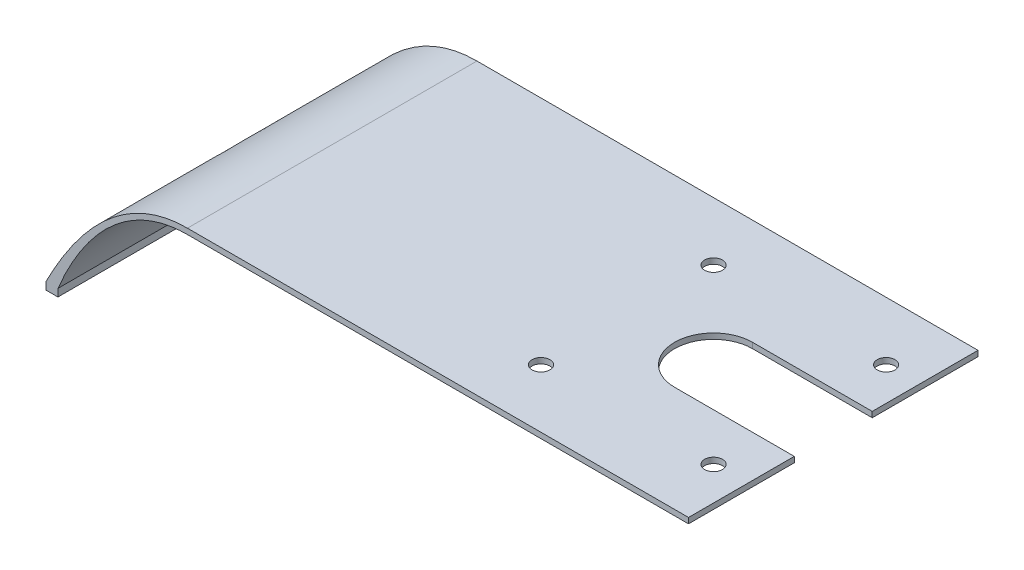
ISO-10303-21;
HEADER;
FILE_DESCRIPTION(('STEP AP214'),'2;1');
FILE_NAME('part.step','',(''),(''),'','','');
FILE_SCHEMA(('AUTOMOTIVE_DESIGN { 1 0 10303 214 1 1 1 1 }'));
ENDSEC;
DATA;
#1=APPLICATION_CONTEXT('core data for automotive mechanical design processes');
#2=APPLICATION_PROTOCOL_DEFINITION('international standard','automotive_design',2000,#1);
#3=PRODUCT_CONTEXT('',#1,'mechanical');
#4=PRODUCT('Part','Part','',(#3));
#5=PRODUCT_RELATED_PRODUCT_CATEGORY('part','',(#4));
#6=PRODUCT_DEFINITION_FORMATION('','',#4);
#7=PRODUCT_DEFINITION_CONTEXT('part definition',#1,'design');
#8=PRODUCT_DEFINITION('design','',#6,#7);
#9=PRODUCT_DEFINITION_SHAPE('','',#8);
#10=(LENGTH_UNIT() NAMED_UNIT(*) SI_UNIT(.MILLI.,.METRE.));
#11=(NAMED_UNIT(*) PLANE_ANGLE_UNIT() SI_UNIT($,.RADIAN.));
#12=(NAMED_UNIT(*) SI_UNIT($,.STERADIAN.) SOLID_ANGLE_UNIT());
#13=UNCERTAINTY_MEASURE_WITH_UNIT(LENGTH_MEASURE(1.E-05),#10,'distance_accuracy_value','');
#14=(GEOMETRIC_REPRESENTATION_CONTEXT(3) GLOBAL_UNCERTAINTY_ASSIGNED_CONTEXT((#13)) GLOBAL_UNIT_ASSIGNED_CONTEXT((#10,
#11,#12)) REPRESENTATION_CONTEXT('',''));
#15=CARTESIAN_POINT('',(0.,0.,0.));
#16=DIRECTION('',(0.,0.,1.));
#17=DIRECTION('',(1.,0.,0.));
#18=AXIS2_PLACEMENT_3D('',#15,#16,#17);
#19=CARTESIAN_POINT('',(90.,20.,52.));
#20=DIRECTION('',(-1.,0.,0.));
#21=DIRECTION('',(0.,0.,1.));
#22=AXIS2_PLACEMENT_3D('',#19,#20,#21);
#23=PLANE('',#22);
#24=DIRECTION('',(0.,0.,-1.));
#25=VECTOR('',#24,1.);
#26=CARTESIAN_POINT('',(90.,20.,52.));
#27=LINE('',#26,#25);
#28=CARTESIAN_POINT('',(90.,20.,52.));
#29=VERTEX_POINT('',#28);
#30=CARTESIAN_POINT('',(90.,20.,33.));
#31=VERTEX_POINT('',#30);
#32=EDGE_CURVE('E129',#29,#31,#27,.T.);
#33=ORIENTED_EDGE('',*,*,#32,.T.);
#34=DIRECTION('',(0.,1.,0.));
#35=VECTOR('',#34,1.);
#36=CARTESIAN_POINT('',(90.,-31.,33.));
#37=LINE('',#36,#35);
#38=CARTESIAN_POINT('',(90.,21.,33.));
#39=VERTEX_POINT('',#38);
#40=EDGE_CURVE('E260',#31,#39,#37,.T.);
#41=ORIENTED_EDGE('',*,*,#40,.T.);
#42=DIRECTION('',(0.,0.,-1.));
#43=VECTOR('',#42,1.);
#44=CARTESIAN_POINT('',(90.,21.,52.));
#45=LINE('',#44,#43);
#46=CARTESIAN_POINT('',(90.,21.,52.));
#47=VERTEX_POINT('',#46);
#48=EDGE_CURVE('E140',#47,#39,#45,.T.);
#49=ORIENTED_EDGE('',*,*,#48,.F.);
#50=DIRECTION('',(0.,1.,0.));
#51=VECTOR('',#50,1.);
#52=CARTESIAN_POINT('',(90.,20.,52.));
#53=LINE('',#52,#51);
#54=EDGE_CURVE('E119',#29,#47,#53,.T.);
#55=ORIENTED_EDGE('',*,*,#54,.F.);
#56=EDGE_LOOP('',(#33,#41,#49,#55));
#57=FACE_BOUND('',#56,.T.);
#58=ADVANCED_FACE('F35',(#57),#23,.F.);
#59=CARTESIAN_POINT('',(0.,21.,52.));
#60=CARTESIAN_POINT('',(-12.5145757386118,21.,52.));
#61=CARTESIAN_POINT('',(-20.5852929416918,9.39347703646513,52.));
#62=CARTESIAN_POINT('',(-25.4098684266543,0.,52.));
#63=B_SPLINE_CURVE_WITH_KNOTS('',3,(#59,#60,#61,#62),.UNSPECIFIED.,.F.,.F.,(4,4),(0.,1.),.UNSPECIFIED.);
#64=DIRECTION('',(0.,0.,-1.));
#65=VECTOR('',#64,1.);
#66=SURFACE_OF_LINEAR_EXTRUSION('',#63,#65);
#67=CARTESIAN_POINT('',(0.,21.,0.));
#68=CARTESIAN_POINT('',(-12.5145757386118,21.,0.));
#69=CARTESIAN_POINT('',(-20.5852929416918,9.39347703646513,0.));
#70=CARTESIAN_POINT('',(-25.4098684266543,0.,0.));
#71=B_SPLINE_CURVE_WITH_KNOTS('',3,(#67,#68,#69,#70),.UNSPECIFIED.,.F.,.F.,(4,4),(0.,1.),.UNSPECIFIED.);
#72=CARTESIAN_POINT('',(0.,21.,0.));
#73=VERTEX_POINT('',#72);
#74=CARTESIAN_POINT('',(-25.4098684266543,0.,0.));
#75=VERTEX_POINT('',#74);
#76=EDGE_CURVE('E146',#73,#75,#71,.T.);
#77=ORIENTED_EDGE('',*,*,#76,.T.);
#78=DIRECTION('',(0.,0.,-1.));
#79=VECTOR('',#78,1.);
#80=CARTESIAN_POINT('',(-25.4098684266543,0.,52.));
#81=LINE('',#80,#79);
#82=CARTESIAN_POINT('',(-25.4098684266543,0.,52.));
#83=VERTEX_POINT('',#82);
#84=EDGE_CURVE('E11',#83,#75,#81,.T.);
#85=ORIENTED_EDGE('',*,*,#84,.F.);
#86=CARTESIAN_POINT('',(0.,21.,52.));
#87=VERTEX_POINT('',#86);
#88=EDGE_CURVE('E174',#87,#83,#63,.T.);
#89=ORIENTED_EDGE('',*,*,#88,.F.);
#90=DIRECTION('',(0.,0.,-1.));
#91=VECTOR('',#90,1.);
#92=CARTESIAN_POINT('',(0.,21.,52.));
#93=LINE('',#92,#91);
#94=EDGE_CURVE('E142',#87,#73,#93,.T.);
#95=ORIENTED_EDGE('',*,*,#94,.T.);
#96=EDGE_LOOP('',(#77,#85,#89,#95));
#97=FACE_BOUND('',#96,.T.);
#98=ADVANCED_FACE('F37',(#97),#66,.F.);
#99=CARTESIAN_POINT('',(-25.4098684266543,0.,52.));
#100=DIRECTION('',(1.,0.,0.));
#101=DIRECTION('',(0.,0.,-1.));
#102=AXIS2_PLACEMENT_3D('',#99,#100,#101);
#103=PLANE('',#102);
#104=DIRECTION('',(0.,-1.,0.));
#105=VECTOR('',#104,1.);
#106=CARTESIAN_POINT('',(-25.4098684266543,0.,0.));
#107=LINE('',#106,#105);
#108=CARTESIAN_POINT('',(-25.4098684266543,-1.34408808895374,0.));
#109=VERTEX_POINT('',#108);
#110=EDGE_CURVE('E151',#75,#109,#107,.T.);
#111=ORIENTED_EDGE('',*,*,#110,.T.);
#112=DIRECTION('',(0.,0.,-1.));
#113=VECTOR('',#112,1.);
#114=CARTESIAN_POINT('',(-25.4098684266543,-1.34408808895374,52.));
#115=LINE('',#114,#113);
#116=CARTESIAN_POINT('',(-25.4098684266543,-1.34408808895374,52.));
#117=VERTEX_POINT('',#116);
#118=EDGE_CURVE('E44',#117,#109,#115,.T.);
#119=ORIENTED_EDGE('',*,*,#118,.F.);
#120=DIRECTION('',(0.,-1.,0.));
#121=VECTOR('',#120,1.);
#122=CARTESIAN_POINT('',(-25.4098684266543,0.,52.));
#123=LINE('',#122,#121);
#124=EDGE_CURVE('E100',#83,#117,#123,.T.);
#125=ORIENTED_EDGE('',*,*,#124,.F.);
#126=ORIENTED_EDGE('',*,*,#84,.T.);
#127=EDGE_LOOP('',(#111,#119,#125,#126));
#128=FACE_BOUND('',#127,.T.);
#129=ADVANCED_FACE('F220',(#128),#103,.F.);
#130=CARTESIAN_POINT('',(-25.4098684266543,-1.34408808895374,52.));
#131=DIRECTION('',(0.,1.,0.));
#132=DIRECTION('',(0.,0.,1.));
#133=AXIS2_PLACEMENT_3D('',#130,#131,#132);
#134=PLANE('',#133);
#135=DIRECTION('',(1.,0.,0.));
#136=VECTOR('',#135,1.);
#137=CARTESIAN_POINT('',(-25.4098684266543,-1.34408808895374,0.));
#138=LINE('',#137,#136);
#139=CARTESIAN_POINT('',(-23.2651190135322,-1.34408808895374,0.));
#140=VERTEX_POINT('',#139);
#141=EDGE_CURVE('E156',#109,#140,#138,.T.);
#142=ORIENTED_EDGE('',*,*,#141,.T.);
#143=DIRECTION('',(0.,0.,-1.));
#144=VECTOR('',#143,1.);
#145=CARTESIAN_POINT('',(-23.2651190135322,-1.34408808895374,52.));
#146=LINE('',#145,#144);
#147=CARTESIAN_POINT('',(-23.2651190135322,-1.34408808895374,52.));
#148=VERTEX_POINT('',#147);
#149=EDGE_CURVE('E182',#148,#140,#146,.T.);
#150=ORIENTED_EDGE('',*,*,#149,.F.);
#151=DIRECTION('',(1.,0.,0.));
#152=VECTOR('',#151,1.);
#153=CARTESIAN_POINT('',(-25.4098684266543,-1.34408808895374,52.));
#154=LINE('',#153,#152);
#155=EDGE_CURVE('E190',#117,#148,#154,.T.);
#156=ORIENTED_EDGE('',*,*,#155,.F.);
#157=ORIENTED_EDGE('',*,*,#118,.T.);
#158=EDGE_LOOP('',(#142,#150,#156,#157));
#159=FACE_BOUND('',#158,.T.);
#160=ADVANCED_FACE('F188',(#159),#134,.F.);
#161=CARTESIAN_POINT('',(-23.2651190135322,-1.34408808895374,52.));
#162=DIRECTION('',(-1.,0.,0.));
#163=DIRECTION('',(0.,0.,1.));
#164=AXIS2_PLACEMENT_3D('',#161,#162,#163);
#165=PLANE('',#164);
#166=DIRECTION('',(0.,1.,0.));
#167=VECTOR('',#166,1.);
#168=CARTESIAN_POINT('',(-23.2651190135322,-1.34408808895374,0.));
#169=LINE('',#168,#167);
#170=CARTESIAN_POINT('',(-23.2651190135322,0.,0.));
#171=VERTEX_POINT('',#170);
#172=EDGE_CURVE('E158',#140,#171,#169,.T.);
#173=ORIENTED_EDGE('',*,*,#172,.T.);
#174=DIRECTION('',(0.,0.,-1.));
#175=VECTOR('',#174,1.);
#176=CARTESIAN_POINT('',(-23.2651190135322,0.,52.));
#177=LINE('',#176,#175);
#178=CARTESIAN_POINT('',(-23.2651190135322,0.,52.));
#179=VERTEX_POINT('',#178);
#180=EDGE_CURVE('E179',#179,#171,#177,.T.);
#181=ORIENTED_EDGE('',*,*,#180,.F.);
#182=DIRECTION('',(0.,1.,0.));
#183=VECTOR('',#182,1.);
#184=CARTESIAN_POINT('',(-23.2651190135322,-1.34408808895374,52.));
#185=LINE('',#184,#183);
#186=EDGE_CURVE('E203',#148,#179,#185,.T.);
#187=ORIENTED_EDGE('',*,*,#186,.F.);
#188=ORIENTED_EDGE('',*,*,#149,.T.);
#189=EDGE_LOOP('',(#173,#181,#187,#188));
#190=FACE_BOUND('',#189,.T.);
#191=ADVANCED_FACE('F199',(#190),#165,.F.);
#192=CARTESIAN_POINT('',(-23.2651190135322,0.,52.));
#193=CARTESIAN_POINT('',(-19.3650802432948,9.42537989625806,52.));
#194=CARTESIAN_POINT('',(-11.9188264514657,20.,52.));
#195=CARTESIAN_POINT('',(0.,20.,52.));
#196=B_SPLINE_CURVE_WITH_KNOTS('',3,(#192,#193,#194,#195),.UNSPECIFIED.,.F.,.F.,(4,4),(0.,1.),.UNSPECIFIED.);
#197=DIRECTION('',(0.,0.,-1.));
#198=VECTOR('',#197,1.);
#199=SURFACE_OF_LINEAR_EXTRUSION('',#196,#198);
#200=CARTESIAN_POINT('',(-23.2651190135322,0.,0.));
#201=CARTESIAN_POINT('',(-19.3650802432948,9.42537989625806,0.));
#202=CARTESIAN_POINT('',(-11.9188264514657,20.,0.));
#203=CARTESIAN_POINT('',(0.,20.,0.));
#204=B_SPLINE_CURVE_WITH_KNOTS('',3,(#200,#201,#202,#203),.UNSPECIFIED.,.F.,.F.,(4,4),(0.,1.),.UNSPECIFIED.);
#205=CARTESIAN_POINT('',(0.,20.,0.));
#206=VERTEX_POINT('',#205);
#207=EDGE_CURVE('E160',#171,#206,#204,.T.);
#208=ORIENTED_EDGE('',*,*,#207,.T.);
#209=DIRECTION('',(0.,0.,-1.));
#210=VECTOR('',#209,1.);
#211=CARTESIAN_POINT('',(0.,20.,52.));
#212=LINE('',#211,#210);
#213=CARTESIAN_POINT('',(0.,20.,52.));
#214=VERTEX_POINT('',#213);
#215=EDGE_CURVE('E136',#214,#206,#212,.T.);
#216=ORIENTED_EDGE('',*,*,#215,.F.);
#217=EDGE_CURVE('E122',#179,#214,#196,.T.);
#218=ORIENTED_EDGE('',*,*,#217,.F.);
#219=ORIENTED_EDGE('',*,*,#180,.T.);
#220=EDGE_LOOP('',(#208,#216,#218,#219));
#221=FACE_BOUND('',#220,.T.);
#222=ADVANCED_FACE('F202',(#221),#199,.F.);
#223=CARTESIAN_POINT('',(0.,20.,52.));
#224=DIRECTION('',(0.,1.,0.));
#225=DIRECTION('',(0.,0.,1.));
#226=AXIS2_PLACEMENT_3D('',#223,#224,#225);
#227=PLANE('',#226);
#228=CARTESIAN_POINT('',(53.,20.,10.5));
#229=DIRECTION('',(0.,1.,0.));
#230=DIRECTION('',(0.,0.,1.));
#231=AXIS2_PLACEMENT_3D('',#228,#229,#230);
#232=CIRCLE('',#231,1.6);
#233=CARTESIAN_POINT('',(53.,20.,12.1));
#234=VERTEX_POINT('',#233);
#235=EDGE_CURVE('E282',#234,#234,#232,.T.);
#236=ORIENTED_EDGE('',*,*,#235,.T.);
#237=EDGE_LOOP('',(#236));
#238=FACE_BOUND('',#237,.T.);
#239=CARTESIAN_POINT('',(53.,20.,41.5));
#240=DIRECTION('',(0.,1.,0.));
#241=DIRECTION('',(0.,0.,1.));
#242=AXIS2_PLACEMENT_3D('',#239,#240,#241);
#243=CIRCLE('',#242,1.60000000000001);
#244=CARTESIAN_POINT('',(53.,20.,43.1));
#245=VERTEX_POINT('',#244);
#246=EDGE_CURVE('E279',#245,#245,#243,.T.);
#247=ORIENTED_EDGE('',*,*,#246,.T.);
#248=EDGE_LOOP('',(#247));
#249=FACE_BOUND('',#248,.T.);
#250=CARTESIAN_POINT('',(84.,20.,41.5));
#251=DIRECTION('',(0.,1.,0.));
#252=DIRECTION('',(0.,0.,1.));
#253=AXIS2_PLACEMENT_3D('',#250,#251,#252);
#254=CIRCLE('',#253,1.60000000000001);
#255=CARTESIAN_POINT('',(84.,20.,43.1));
#256=VERTEX_POINT('',#255);
#257=EDGE_CURVE('E276',#256,#256,#254,.T.);
#258=ORIENTED_EDGE('',*,*,#257,.T.);
#259=EDGE_LOOP('',(#258));
#260=FACE_BOUND('',#259,.T.);
#261=CARTESIAN_POINT('',(84.,20.,10.5));
#262=DIRECTION('',(0.,1.,0.));
#263=DIRECTION('',(0.,0.,1.));
#264=AXIS2_PLACEMENT_3D('',#261,#262,#263);
#265=CIRCLE('',#264,1.6);
#266=CARTESIAN_POINT('',(84.,20.,12.1));
#267=VERTEX_POINT('',#266);
#268=EDGE_CURVE('E272',#267,#267,#265,.T.);
#269=ORIENTED_EDGE('',*,*,#268,.T.);
#270=EDGE_LOOP('',(#269));
#271=FACE_BOUND('',#270,.T.);
#272=CARTESIAN_POINT('',(68.5,20.,26.));
#273=DIRECTION('',(0.,1.,0.));
#274=DIRECTION('',(0.,0.,1.));
#275=AXIS2_PLACEMENT_3D('',#272,#273,#274);
#276=CIRCLE('',#275,7.);
#277=CARTESIAN_POINT('',(68.5,20.,19.));
#278=VERTEX_POINT('',#277);
#279=CARTESIAN_POINT('',(68.5,20.,33.));
#280=VERTEX_POINT('',#279);
#281=EDGE_CURVE('E288',#278,#280,#276,.T.);
#282=ORIENTED_EDGE('',*,*,#281,.T.);
#283=DIRECTION('',(1.,0.,0.));
#284=VECTOR('',#283,1.);
#285=CARTESIAN_POINT('',(0.,20.,33.));
#286=LINE('',#285,#284);
#287=EDGE_CURVE('E133',#280,#31,#286,.T.);
#288=ORIENTED_EDGE('',*,*,#287,.T.);
#289=ORIENTED_EDGE('',*,*,#32,.F.);
#290=DIRECTION('',(1.,0.,0.));
#291=VECTOR('',#290,1.);
#292=CARTESIAN_POINT('',(0.,20.,52.));
#293=LINE('',#292,#291);
#294=EDGE_CURVE('E115',#214,#29,#293,.T.);
#295=ORIENTED_EDGE('',*,*,#294,.F.);
#296=ORIENTED_EDGE('',*,*,#215,.T.);
#297=DIRECTION('',(1.,0.,0.));
#298=VECTOR('',#297,1.);
#299=CARTESIAN_POINT('',(0.,20.,0.));
#300=LINE('',#299,#298);
#301=CARTESIAN_POINT('',(90.,20.,0.));
#302=VERTEX_POINT('',#301);
#303=EDGE_CURVE('E164',#206,#302,#300,.T.);
#304=ORIENTED_EDGE('',*,*,#303,.T.);
#305=CARTESIAN_POINT('',(90.,20.,19.));
#306=VERTEX_POINT('',#305);
#307=EDGE_CURVE('E137',#306,#302,#27,.T.);
#308=ORIENTED_EDGE('',*,*,#307,.F.);
#309=DIRECTION('',(-1.,0.,0.));
#310=VECTOR('',#309,1.);
#311=CARTESIAN_POINT('',(0.,20.,19.));
#312=LINE('',#311,#310);
#313=EDGE_CURVE('E285',#306,#278,#312,.T.);
#314=ORIENTED_EDGE('',*,*,#313,.T.);
#315=EDGE_LOOP('',(#282,#288,#289,#295,#296,#304,#308,#314));
#316=FACE_BOUND('',#315,.T.);
#317=ADVANCED_FACE('F131',(#238,#249,#260,#271,#316),#227,.F.);
#318=CARTESIAN_POINT('',(90.,21.,19.));
#319=VERTEX_POINT('',#318);
#320=CARTESIAN_POINT('',(90.,21.,0.));
#321=VERTEX_POINT('',#320);
#322=EDGE_CURVE('E176',#319,#321,#45,.T.);
#323=ORIENTED_EDGE('',*,*,#322,.F.);
#324=DIRECTION('',(0.,1.,0.));
#325=VECTOR('',#324,1.);
#326=CARTESIAN_POINT('',(90.,-31.,19.));
#327=LINE('',#326,#325);
#328=EDGE_CURVE('E51',#306,#319,#327,.T.);
#329=ORIENTED_EDGE('',*,*,#328,.F.);
#330=ORIENTED_EDGE('',*,*,#307,.T.);
#331=DIRECTION('',(0.,1.,0.));
#332=VECTOR('',#331,1.);
#333=CARTESIAN_POINT('',(90.,20.,0.));
#334=LINE('',#333,#332);
#335=EDGE_CURVE('E170',#302,#321,#334,.T.);
#336=ORIENTED_EDGE('',*,*,#335,.T.);
#337=EDGE_LOOP('',(#323,#329,#330,#336));
#338=FACE_BOUND('',#337,.T.);
#339=ADVANCED_FACE('F227',(#338),#23,.F.);
#340=CARTESIAN_POINT('',(0.,21.,52.));
#341=DIRECTION('',(0.,-1.,0.));
#342=DIRECTION('',(0.,0.,-1.));
#343=AXIS2_PLACEMENT_3D('',#340,#341,#342);
#344=PLANE('',#343);
#345=CARTESIAN_POINT('',(53.,21.,10.5));
#346=DIRECTION('',(0.,1.,0.));
#347=DIRECTION('',(0.,0.,-1.));
#348=AXIS2_PLACEMENT_3D('',#345,#346,#347);
#349=CIRCLE('',#348,1.6);
#350=CARTESIAN_POINT('',(53.,21.,12.1));
#351=VERTEX_POINT('',#350);
#352=EDGE_CURVE('E255',#351,#351,#349,.T.);
#353=ORIENTED_EDGE('',*,*,#352,.F.);
#354=EDGE_LOOP('',(#353));
#355=FACE_BOUND('',#354,.T.);
#356=CARTESIAN_POINT('',(53.,21.,41.5));
#357=DIRECTION('',(0.,1.,0.));
#358=DIRECTION('',(0.,0.,1.));
#359=AXIS2_PLACEMENT_3D('',#356,#357,#358);
#360=CIRCLE('',#359,1.60000000000001);
#361=CARTESIAN_POINT('',(53.,21.,43.1));
#362=VERTEX_POINT('',#361);
#363=EDGE_CURVE('E457',#362,#362,#360,.T.);
#364=ORIENTED_EDGE('',*,*,#363,.F.);
#365=EDGE_LOOP('',(#364));
#366=FACE_BOUND('',#365,.T.);
#367=CARTESIAN_POINT('',(84.,21.,41.5));
#368=DIRECTION('',(0.,1.,0.));
#369=DIRECTION('',(0.,0.,-1.));
#370=AXIS2_PLACEMENT_3D('',#367,#368,#369);
#371=CIRCLE('',#370,1.60000000000001);
#372=CARTESIAN_POINT('',(84.,21.,43.1));
#373=VERTEX_POINT('',#372);
#374=EDGE_CURVE('E273',#373,#373,#371,.T.);
#375=ORIENTED_EDGE('',*,*,#374,.F.);
#376=EDGE_LOOP('',(#375));
#377=FACE_BOUND('',#376,.T.);
#378=CARTESIAN_POINT('',(84.,21.,10.5));
#379=DIRECTION('',(0.,1.,0.));
#380=DIRECTION('',(0.,0.,1.));
#381=AXIS2_PLACEMENT_3D('',#378,#379,#380);
#382=CIRCLE('',#381,1.6);
#383=CARTESIAN_POINT('',(84.,21.,12.1));
#384=VERTEX_POINT('',#383);
#385=EDGE_CURVE('E269',#384,#384,#382,.T.);
#386=ORIENTED_EDGE('',*,*,#385,.F.);
#387=EDGE_LOOP('',(#386));
#388=FACE_BOUND('',#387,.T.);
#389=ORIENTED_EDGE('',*,*,#48,.T.);
#390=DIRECTION('',(1.,0.,0.));
#391=VECTOR('',#390,1.);
#392=CARTESIAN_POINT('',(68.5,21.,33.));
#393=LINE('',#392,#391);
#394=CARTESIAN_POINT('',(68.5,21.,33.));
#395=VERTEX_POINT('',#394);
#396=EDGE_CURVE('E252',#395,#39,#393,.T.);
#397=ORIENTED_EDGE('',*,*,#396,.F.);
#398=CARTESIAN_POINT('',(68.5,21.,26.));
#399=DIRECTION('',(0.,1.,0.));
#400=DIRECTION('',(0.,0.,1.));
#401=AXIS2_PLACEMENT_3D('',#398,#399,#400);
#402=CIRCLE('',#401,7.);
#403=CARTESIAN_POINT('',(68.5,21.,19.));
#404=VERTEX_POINT('',#403);
#405=EDGE_CURVE('E249',#404,#395,#402,.T.);
#406=ORIENTED_EDGE('',*,*,#405,.F.);
#407=DIRECTION('',(-1.,0.,0.));
#408=VECTOR('',#407,1.);
#409=CARTESIAN_POINT('',(90.,21.,19.));
#410=LINE('',#409,#408);
#411=EDGE_CURVE('E245',#319,#404,#410,.T.);
#412=ORIENTED_EDGE('',*,*,#411,.F.);
#413=ORIENTED_EDGE('',*,*,#322,.T.);
#414=DIRECTION('',(-1.,0.,0.));
#415=VECTOR('',#414,1.);
#416=CARTESIAN_POINT('',(0.,21.,0.));
#417=LINE('',#416,#415);
#418=EDGE_CURVE('E92',#321,#73,#417,.T.);
#419=ORIENTED_EDGE('',*,*,#418,.T.);
#420=ORIENTED_EDGE('',*,*,#94,.F.);
#421=DIRECTION('',(-1.,0.,0.));
#422=VECTOR('',#421,1.);
#423=CARTESIAN_POINT('',(0.,21.,52.));
#424=LINE('',#423,#422);
#425=EDGE_CURVE('E60',#47,#87,#424,.T.);
#426=ORIENTED_EDGE('',*,*,#425,.F.);
#427=EDGE_LOOP('',(#389,#397,#406,#412,#413,#419,#420,#426));
#428=FACE_BOUND('',#427,.T.);
#429=ADVANCED_FACE('F232',(#355,#366,#377,#388,#428),#344,.F.);
#430=CARTESIAN_POINT('',(-15.5886843084456,14.0225538886744,52.));
#431=DIRECTION('',(0.,0.,-1.));
#432=DIRECTION('',(-1.,0.,0.));
#433=AXIS2_PLACEMENT_3D('',#430,#431,#432);
#434=PLANE('',#433);
#435=ORIENTED_EDGE('',*,*,#88,.T.);
#436=ORIENTED_EDGE('',*,*,#124,.T.);
#437=ORIENTED_EDGE('',*,*,#155,.T.);
#438=ORIENTED_EDGE('',*,*,#186,.T.);
#439=ORIENTED_EDGE('',*,*,#217,.T.);
#440=ORIENTED_EDGE('',*,*,#294,.T.);
#441=ORIENTED_EDGE('',*,*,#54,.T.);
#442=ORIENTED_EDGE('',*,*,#425,.T.);
#443=EDGE_LOOP('',(#435,#436,#437,#438,#439,#440,#441,#442));
#444=FACE_BOUND('',#443,.T.);
#445=ADVANCED_FACE('F117',(#444),#434,.F.);
#446=CARTESIAN_POINT('',(-15.5886843084456,14.0225538886744,0.));
#447=DIRECTION('',(0.,0.,-1.));
#448=DIRECTION('',(-1.,0.,0.));
#449=AXIS2_PLACEMENT_3D('',#446,#447,#448);
#450=PLANE('',#449);
#451=ORIENTED_EDGE('',*,*,#76,.F.);
#452=ORIENTED_EDGE('',*,*,#418,.F.);
#453=ORIENTED_EDGE('',*,*,#335,.F.);
#454=ORIENTED_EDGE('',*,*,#303,.F.);
#455=ORIENTED_EDGE('',*,*,#207,.F.);
#456=ORIENTED_EDGE('',*,*,#172,.F.);
#457=ORIENTED_EDGE('',*,*,#141,.F.);
#458=ORIENTED_EDGE('',*,*,#110,.F.);
#459=EDGE_LOOP('',(#451,#452,#453,#454,#455,#456,#457,#458));
#460=FACE_BOUND('',#459,.T.);
#461=ADVANCED_FACE('F194',(#460),#450,.T.);
#462=CARTESIAN_POINT('',(84.,-31.,10.5));
#463=DIRECTION('',(0.,1.,0.));
#464=DIRECTION('',(0.,0.,1.));
#465=AXIS2_PLACEMENT_3D('',#462,#463,#464);
#466=CYLINDRICAL_SURFACE('',#465,1.6);
#467=CARTESIAN_POINT('',(84.,21.,12.1));
#468=CARTESIAN_POINT('',(84.,20.9895833333333,12.1));
#469=CARTESIAN_POINT('',(84.,20.9791666666667,12.1));
#470=CARTESIAN_POINT('',(84.,20.9583333333333,12.1));
#471=CARTESIAN_POINT('',(84.,20.9479166666667,12.1));
#472=CARTESIAN_POINT('',(84.,20.9270833333333,12.1));
#473=CARTESIAN_POINT('',(84.,20.9166666666667,12.1));
#474=CARTESIAN_POINT('',(84.,20.8958333333333,12.1));
#475=CARTESIAN_POINT('',(84.,20.8854166666667,12.1));
#476=CARTESIAN_POINT('',(84.,20.8645833333333,12.1));
#477=CARTESIAN_POINT('',(84.,20.8541666666667,12.1));
#478=CARTESIAN_POINT('',(84.,20.8333333333333,12.1));
#479=CARTESIAN_POINT('',(84.,20.8229166666667,12.1));
#480=CARTESIAN_POINT('',(84.,20.8020833333333,12.1));
#481=CARTESIAN_POINT('',(84.,20.7916666666667,12.1));
#482=CARTESIAN_POINT('',(84.,20.7708333333333,12.1));
#483=CARTESIAN_POINT('',(84.,20.7604166666667,12.1));
#484=CARTESIAN_POINT('',(84.,20.7395833333333,12.1));
#485=CARTESIAN_POINT('',(84.,20.7291666666667,12.1));
#486=CARTESIAN_POINT('',(84.,20.7083333333333,12.1));
#487=CARTESIAN_POINT('',(84.,20.6979166666667,12.1));
#488=CARTESIAN_POINT('',(84.,20.6770833333333,12.1));
#489=CARTESIAN_POINT('',(84.,20.6666666666667,12.1));
#490=CARTESIAN_POINT('',(84.,20.6458333333333,12.1));
#491=CARTESIAN_POINT('',(84.,20.6354166666667,12.1));
#492=CARTESIAN_POINT('',(84.,20.6145833333333,12.1));
#493=CARTESIAN_POINT('',(84.,20.6041666666667,12.1));
#494=CARTESIAN_POINT('',(84.,20.5833333333333,12.1));
#495=CARTESIAN_POINT('',(84.,20.5729166666667,12.1));
#496=CARTESIAN_POINT('',(84.,20.5520833333333,12.1));
#497=CARTESIAN_POINT('',(84.,20.5416666666667,12.1));
#498=CARTESIAN_POINT('',(84.,20.5208333333333,12.1));
#499=CARTESIAN_POINT('',(84.,20.5104166666667,12.1));
#500=CARTESIAN_POINT('',(84.,20.4895833333333,12.1));
#501=CARTESIAN_POINT('',(84.,20.4791666666667,12.1));
#502=CARTESIAN_POINT('',(84.,20.4583333333333,12.1));
#503=CARTESIAN_POINT('',(84.,20.4479166666667,12.1));
#504=CARTESIAN_POINT('',(84.,20.4270833333333,12.1));
#505=CARTESIAN_POINT('',(84.,20.4166666666667,12.1));
#506=CARTESIAN_POINT('',(84.,20.3958333333333,12.1));
#507=CARTESIAN_POINT('',(84.,20.3854166666667,12.1));
#508=CARTESIAN_POINT('',(84.,20.3645833333333,12.1));
#509=CARTESIAN_POINT('',(84.,20.3541666666667,12.1));
#510=CARTESIAN_POINT('',(84.,20.3333333333333,12.1));
#511=CARTESIAN_POINT('',(84.,20.3229166666667,12.1));
#512=CARTESIAN_POINT('',(84.,20.3020833333333,12.1));
#513=CARTESIAN_POINT('',(84.,20.2916666666667,12.1));
#514=CARTESIAN_POINT('',(84.,20.2708333333333,12.1));
#515=CARTESIAN_POINT('',(84.,20.2604166666667,12.1));
#516=CARTESIAN_POINT('',(84.,20.2395833333333,12.1));
#517=CARTESIAN_POINT('',(84.,20.2291666666667,12.1));
#518=CARTESIAN_POINT('',(84.,20.2083333333333,12.1));
#519=CARTESIAN_POINT('',(84.,20.1979166666667,12.1));
#520=CARTESIAN_POINT('',(84.,20.1770833333333,12.1));
#521=CARTESIAN_POINT('',(84.,20.1666666666667,12.1));
#522=CARTESIAN_POINT('',(84.,20.1458333333333,12.1));
#523=CARTESIAN_POINT('',(84.,20.1354166666667,12.1));
#524=CARTESIAN_POINT('',(84.,20.1145833333333,12.1));
#525=CARTESIAN_POINT('',(84.,20.1041666666667,12.1));
#526=CARTESIAN_POINT('',(84.,20.0833333333333,12.1));
#527=CARTESIAN_POINT('',(84.,20.0729166666667,12.1));
#528=CARTESIAN_POINT('',(84.,20.0520833333333,12.1));
#529=CARTESIAN_POINT('',(84.,20.0416666666667,12.1));
#530=CARTESIAN_POINT('',(84.,20.0208333333333,12.1));
#531=CARTESIAN_POINT('',(84.,20.0104166666667,12.1));
#532=CARTESIAN_POINT('',(84.,20.,12.1));
#533=B_SPLINE_CURVE_WITH_KNOTS('',3,(#467,#468,#469,#470,#471,#472,#473,#474,#475,#476,#477,
#478,#479,#480,#481,#482,#483,#484,#485,#486,#487,#488,#489,#490,#491,#492,#493,#494,#495,#496,
#497,#498,#499,#500,#501,#502,#503,#504,#505,#506,#507,#508,#509,#510,#511,#512,#513,#514,#515,
#516,#517,#518,#519,#520,#521,#522,#523,#524,#525,#526,#527,#528,#529,#530,#531,#532),
.UNSPECIFIED.,.F.,.F.,(4,2,2,2,2,2,2,2,2,2,2,2,2,2,2,2,2,2,2,2,2,2,2,2,2,2,2,2,2,2,2,2,4),(0.,
0.0312499999999966,0.0625000000000001,0.0937500000000036,0.125,0.156249999999997,0.1875,
0.218750000000004,0.25,0.281249999999997,0.3125,0.343750000000004,0.375,0.406249999999997,
0.4375,0.468750000000004,0.5,0.531249999999997,0.5625,0.593750000000004,0.625000000000001,
0.656249999999997,0.687500000000001,0.718750000000004,0.750000000000001,0.781249999999997,
0.812500000000001,0.843750000000004,0.875000000000001,0.906249999999997,0.937500000000001,
0.968750000000004,1.),.UNSPECIFIED.);
#534=EDGE_CURVE('BSEAM324',#384,#267,#533,.T.);
#535=ORIENTED_EDGE('',*,*,#385,.T.);
#536=ORIENTED_EDGE('',*,*,#268,.F.);
#537=ORIENTED_EDGE('',*,*,#534,.T.);
#538=ORIENTED_EDGE('',*,*,#534,.F.);
#539=EDGE_LOOP('',(#535,#537,#536,#538));
#540=FACE_BOUND('',#539,.T.);
#541=ADVANCED_FACE('F324',(#540),#466,.F.);
#542=CARTESIAN_POINT('',(84.,-31.,41.5));
#543=DIRECTION('',(0.,1.,0.));
#544=DIRECTION('',(0.,0.,1.));
#545=AXIS2_PLACEMENT_3D('',#542,#543,#544);
#546=CYLINDRICAL_SURFACE('',#545,1.60000000000001);
#547=CARTESIAN_POINT('',(84.,21.,43.1));
#548=CARTESIAN_POINT('',(84.,20.9895833333333,43.1));
#549=CARTESIAN_POINT('',(84.,20.9791666666667,43.1));
#550=CARTESIAN_POINT('',(84.,20.9583333333333,43.1));
#551=CARTESIAN_POINT('',(84.,20.9479166666667,43.1));
#552=CARTESIAN_POINT('',(84.,20.9270833333333,43.1));
#553=CARTESIAN_POINT('',(84.,20.9166666666667,43.1));
#554=CARTESIAN_POINT('',(84.,20.8958333333333,43.1));
#555=CARTESIAN_POINT('',(84.,20.8854166666667,43.1));
#556=CARTESIAN_POINT('',(84.,20.8645833333333,43.1));
#557=CARTESIAN_POINT('',(84.,20.8541666666667,43.1));
#558=CARTESIAN_POINT('',(84.,20.8333333333333,43.1));
#559=CARTESIAN_POINT('',(84.,20.8229166666667,43.1));
#560=CARTESIAN_POINT('',(84.,20.8020833333333,43.1));
#561=CARTESIAN_POINT('',(84.,20.7916666666667,43.1));
#562=CARTESIAN_POINT('',(84.,20.7708333333333,43.1));
#563=CARTESIAN_POINT('',(84.,20.7604166666667,43.1));
#564=CARTESIAN_POINT('',(84.,20.7395833333333,43.1));
#565=CARTESIAN_POINT('',(84.,20.7291666666667,43.1));
#566=CARTESIAN_POINT('',(84.,20.7083333333333,43.1));
#567=CARTESIAN_POINT('',(84.,20.6979166666667,43.1));
#568=CARTESIAN_POINT('',(84.,20.6770833333333,43.1));
#569=CARTESIAN_POINT('',(84.,20.6666666666667,43.1));
#570=CARTESIAN_POINT('',(84.,20.6458333333333,43.1));
#571=CARTESIAN_POINT('',(84.,20.6354166666667,43.1));
#572=CARTESIAN_POINT('',(84.,20.6145833333333,43.1));
#573=CARTESIAN_POINT('',(84.,20.6041666666667,43.1));
#574=CARTESIAN_POINT('',(84.,20.5833333333333,43.1));
#575=CARTESIAN_POINT('',(84.,20.5729166666667,43.1));
#576=CARTESIAN_POINT('',(84.,20.5520833333333,43.1));
#577=CARTESIAN_POINT('',(84.,20.5416666666667,43.1));
#578=CARTESIAN_POINT('',(84.,20.5208333333333,43.1));
#579=CARTESIAN_POINT('',(84.,20.5104166666667,43.1));
#580=CARTESIAN_POINT('',(84.,20.4895833333333,43.1));
#581=CARTESIAN_POINT('',(84.,20.4791666666667,43.1));
#582=CARTESIAN_POINT('',(84.,20.4583333333333,43.1));
#583=CARTESIAN_POINT('',(84.,20.4479166666667,43.1));
#584=CARTESIAN_POINT('',(84.,20.4270833333333,43.1));
#585=CARTESIAN_POINT('',(84.,20.4166666666667,43.1));
#586=CARTESIAN_POINT('',(84.,20.3958333333333,43.1));
#587=CARTESIAN_POINT('',(84.,20.3854166666667,43.1));
#588=CARTESIAN_POINT('',(84.,20.3645833333333,43.1));
#589=CARTESIAN_POINT('',(84.,20.3541666666667,43.1));
#590=CARTESIAN_POINT('',(84.,20.3333333333333,43.1));
#591=CARTESIAN_POINT('',(84.,20.3229166666667,43.1));
#592=CARTESIAN_POINT('',(84.,20.3020833333333,43.1));
#593=CARTESIAN_POINT('',(84.,20.2916666666667,43.1));
#594=CARTESIAN_POINT('',(84.,20.2708333333333,43.1));
#595=CARTESIAN_POINT('',(84.,20.2604166666667,43.1));
#596=CARTESIAN_POINT('',(84.,20.2395833333333,43.1));
#597=CARTESIAN_POINT('',(84.,20.2291666666667,43.1));
#598=CARTESIAN_POINT('',(84.,20.2083333333333,43.1));
#599=CARTESIAN_POINT('',(84.,20.1979166666667,43.1));
#600=CARTESIAN_POINT('',(84.,20.1770833333333,43.1));
#601=CARTESIAN_POINT('',(84.,20.1666666666667,43.1));
#602=CARTESIAN_POINT('',(84.,20.1458333333333,43.1));
#603=CARTESIAN_POINT('',(84.,20.1354166666667,43.1));
#604=CARTESIAN_POINT('',(84.,20.1145833333333,43.1));
#605=CARTESIAN_POINT('',(84.,20.1041666666667,43.1));
#606=CARTESIAN_POINT('',(84.,20.0833333333333,43.1));
#607=CARTESIAN_POINT('',(84.,20.0729166666667,43.1));
#608=CARTESIAN_POINT('',(84.,20.0520833333333,43.1));
#609=CARTESIAN_POINT('',(84.,20.0416666666667,43.1));
#610=CARTESIAN_POINT('',(84.,20.0208333333333,43.1));
#611=CARTESIAN_POINT('',(84.,20.0104166666667,43.1));
#612=CARTESIAN_POINT('',(84.,20.,43.1));
#613=B_SPLINE_CURVE_WITH_KNOTS('',3,(#547,#548,#549,#550,#551,#552,#553,#554,#555,#556,#557,
#558,#559,#560,#561,#562,#563,#564,#565,#566,#567,#568,#569,#570,#571,#572,#573,#574,#575,#576,
#577,#578,#579,#580,#581,#582,#583,#584,#585,#586,#587,#588,#589,#590,#591,#592,#593,#594,#595,
#596,#597,#598,#599,#600,#601,#602,#603,#604,#605,#606,#607,#608,#609,#610,#611,#612),
.UNSPECIFIED.,.F.,.F.,(4,2,2,2,2,2,2,2,2,2,2,2,2,2,2,2,2,2,2,2,2,2,2,2,2,2,2,2,2,2,2,2,4),(0.,
0.0312499999999966,0.0625000000000001,0.0937500000000036,0.125,0.156249999999997,0.1875,
0.218750000000004,0.25,0.281249999999997,0.3125,0.343750000000004,0.375,0.406249999999997,
0.4375,0.468750000000004,0.5,0.531249999999997,0.5625,0.593750000000004,0.625000000000001,
0.656249999999997,0.687500000000001,0.718750000000004,0.750000000000001,0.781249999999997,
0.812500000000001,0.843750000000004,0.875000000000001,0.906249999999997,0.937500000000001,
0.968750000000004,1.),.UNSPECIFIED.);
#614=EDGE_CURVE('BSEAM327',#373,#256,#613,.T.);
#615=ORIENTED_EDGE('',*,*,#374,.T.);
#616=ORIENTED_EDGE('',*,*,#257,.F.);
#617=ORIENTED_EDGE('',*,*,#614,.T.);
#618=ORIENTED_EDGE('',*,*,#614,.F.);
#619=EDGE_LOOP('',(#615,#617,#616,#618));
#620=FACE_BOUND('',#619,.T.);
#621=ADVANCED_FACE('F327',(#620),#546,.F.);
#622=CARTESIAN_POINT('',(53.,-31.,41.5));
#623=DIRECTION('',(0.,1.,0.));
#624=DIRECTION('',(0.,0.,1.));
#625=AXIS2_PLACEMENT_3D('',#622,#623,#624);
#626=CYLINDRICAL_SURFACE('',#625,1.60000000000001);
#627=CARTESIAN_POINT('',(53.,21.,43.1));
#628=CARTESIAN_POINT('',(53.,20.9895833333333,43.1));
#629=CARTESIAN_POINT('',(53.,20.9791666666667,43.1));
#630=CARTESIAN_POINT('',(53.,20.9583333333333,43.1));
#631=CARTESIAN_POINT('',(53.,20.9479166666667,43.1));
#632=CARTESIAN_POINT('',(53.,20.9270833333333,43.1));
#633=CARTESIAN_POINT('',(53.,20.9166666666667,43.1));
#634=CARTESIAN_POINT('',(53.,20.8958333333333,43.1));
#635=CARTESIAN_POINT('',(53.,20.8854166666667,43.1));
#636=CARTESIAN_POINT('',(53.,20.8645833333333,43.1));
#637=CARTESIAN_POINT('',(53.,20.8541666666667,43.1));
#638=CARTESIAN_POINT('',(53.,20.8333333333333,43.1));
#639=CARTESIAN_POINT('',(53.,20.8229166666667,43.1));
#640=CARTESIAN_POINT('',(53.,20.8020833333333,43.1));
#641=CARTESIAN_POINT('',(53.,20.7916666666667,43.1));
#642=CARTESIAN_POINT('',(53.,20.7708333333333,43.1));
#643=CARTESIAN_POINT('',(53.,20.7604166666667,43.1));
#644=CARTESIAN_POINT('',(53.,20.7395833333333,43.1));
#645=CARTESIAN_POINT('',(53.,20.7291666666667,43.1));
#646=CARTESIAN_POINT('',(53.,20.7083333333333,43.1));
#647=CARTESIAN_POINT('',(53.,20.6979166666667,43.1));
#648=CARTESIAN_POINT('',(53.,20.6770833333333,43.1));
#649=CARTESIAN_POINT('',(53.,20.6666666666667,43.1));
#650=CARTESIAN_POINT('',(53.,20.6458333333333,43.1));
#651=CARTESIAN_POINT('',(53.,20.6354166666667,43.1));
#652=CARTESIAN_POINT('',(53.,20.6145833333333,43.1));
#653=CARTESIAN_POINT('',(53.,20.6041666666667,43.1));
#654=CARTESIAN_POINT('',(53.,20.5833333333333,43.1));
#655=CARTESIAN_POINT('',(53.,20.5729166666667,43.1));
#656=CARTESIAN_POINT('',(53.,20.5520833333333,43.1));
#657=CARTESIAN_POINT('',(53.,20.5416666666667,43.1));
#658=CARTESIAN_POINT('',(53.,20.5208333333333,43.1));
#659=CARTESIAN_POINT('',(53.,20.5104166666667,43.1));
#660=CARTESIAN_POINT('',(53.,20.4895833333333,43.1));
#661=CARTESIAN_POINT('',(53.,20.4791666666667,43.1));
#662=CARTESIAN_POINT('',(53.,20.4583333333333,43.1));
#663=CARTESIAN_POINT('',(53.,20.4479166666667,43.1));
#664=CARTESIAN_POINT('',(53.,20.4270833333333,43.1));
#665=CARTESIAN_POINT('',(53.,20.4166666666667,43.1));
#666=CARTESIAN_POINT('',(53.,20.3958333333333,43.1));
#667=CARTESIAN_POINT('',(53.,20.3854166666667,43.1));
#668=CARTESIAN_POINT('',(53.,20.3645833333333,43.1));
#669=CARTESIAN_POINT('',(53.,20.3541666666667,43.1));
#670=CARTESIAN_POINT('',(53.,20.3333333333333,43.1));
#671=CARTESIAN_POINT('',(53.,20.3229166666667,43.1));
#672=CARTESIAN_POINT('',(53.,20.3020833333333,43.1));
#673=CARTESIAN_POINT('',(53.,20.2916666666667,43.1));
#674=CARTESIAN_POINT('',(53.,20.2708333333333,43.1));
#675=CARTESIAN_POINT('',(53.,20.2604166666667,43.1));
#676=CARTESIAN_POINT('',(53.,20.2395833333333,43.1));
#677=CARTESIAN_POINT('',(53.,20.2291666666667,43.1));
#678=CARTESIAN_POINT('',(53.,20.2083333333333,43.1));
#679=CARTESIAN_POINT('',(53.,20.1979166666667,43.1));
#680=CARTESIAN_POINT('',(53.,20.1770833333333,43.1));
#681=CARTESIAN_POINT('',(53.,20.1666666666667,43.1));
#682=CARTESIAN_POINT('',(53.,20.1458333333333,43.1));
#683=CARTESIAN_POINT('',(53.,20.1354166666667,43.1));
#684=CARTESIAN_POINT('',(53.,20.1145833333333,43.1));
#685=CARTESIAN_POINT('',(53.,20.1041666666667,43.1));
#686=CARTESIAN_POINT('',(53.,20.0833333333333,43.1));
#687=CARTESIAN_POINT('',(53.,20.0729166666667,43.1));
#688=CARTESIAN_POINT('',(53.,20.0520833333333,43.1));
#689=CARTESIAN_POINT('',(53.,20.0416666666667,43.1));
#690=CARTESIAN_POINT('',(53.,20.0208333333333,43.1));
#691=CARTESIAN_POINT('',(53.,20.0104166666667,43.1));
#692=CARTESIAN_POINT('',(53.,20.,43.1));
#693=B_SPLINE_CURVE_WITH_KNOTS('',3,(#627,#628,#629,#630,#631,#632,#633,#634,#635,#636,#637,
#638,#639,#640,#641,#642,#643,#644,#645,#646,#647,#648,#649,#650,#651,#652,#653,#654,#655,#656,
#657,#658,#659,#660,#661,#662,#663,#664,#665,#666,#667,#668,#669,#670,#671,#672,#673,#674,#675,
#676,#677,#678,#679,#680,#681,#682,#683,#684,#685,#686,#687,#688,#689,#690,#691,#692),
.UNSPECIFIED.,.F.,.F.,(4,2,2,2,2,2,2,2,2,2,2,2,2,2,2,2,2,2,2,2,2,2,2,2,2,2,2,2,2,2,2,2,4),(0.,
0.0312499999999966,0.0625000000000001,0.0937500000000036,0.125,0.156249999999997,0.1875,
0.218750000000004,0.25,0.281249999999997,0.3125,0.343750000000004,0.375,0.406249999999997,
0.4375,0.468750000000004,0.5,0.531249999999997,0.5625,0.593750000000004,0.625000000000001,
0.656249999999997,0.687500000000001,0.718750000000004,0.750000000000001,0.781249999999997,
0.812500000000001,0.843750000000004,0.875000000000001,0.906249999999997,0.937500000000001,
0.968750000000004,1.),.UNSPECIFIED.);
#694=EDGE_CURVE('BSEAM347',#362,#245,#693,.T.);
#695=ORIENTED_EDGE('',*,*,#363,.T.);
#696=ORIENTED_EDGE('',*,*,#246,.F.);
#697=ORIENTED_EDGE('',*,*,#694,.T.);
#698=ORIENTED_EDGE('',*,*,#694,.F.);
#699=EDGE_LOOP('',(#695,#697,#696,#698));
#700=FACE_BOUND('',#699,.T.);
#701=ADVANCED_FACE('F347',(#700),#626,.F.);
#702=CARTESIAN_POINT('',(53.,-31.,10.5));
#703=DIRECTION('',(0.,1.,0.));
#704=DIRECTION('',(0.,0.,1.));
#705=AXIS2_PLACEMENT_3D('',#702,#703,#704);
#706=CYLINDRICAL_SURFACE('',#705,1.6);
#707=CARTESIAN_POINT('',(53.,21.,12.1));
#708=CARTESIAN_POINT('',(53.,20.9895833333333,12.1));
#709=CARTESIAN_POINT('',(53.,20.9791666666667,12.1));
#710=CARTESIAN_POINT('',(53.,20.9583333333333,12.1));
#711=CARTESIAN_POINT('',(53.,20.9479166666667,12.1));
#712=CARTESIAN_POINT('',(53.,20.9270833333333,12.1));
#713=CARTESIAN_POINT('',(53.,20.9166666666667,12.1));
#714=CARTESIAN_POINT('',(53.,20.8958333333333,12.1));
#715=CARTESIAN_POINT('',(53.,20.8854166666667,12.1));
#716=CARTESIAN_POINT('',(53.,20.8645833333333,12.1));
#717=CARTESIAN_POINT('',(53.,20.8541666666667,12.1));
#718=CARTESIAN_POINT('',(53.,20.8333333333333,12.1));
#719=CARTESIAN_POINT('',(53.,20.8229166666667,12.1));
#720=CARTESIAN_POINT('',(53.,20.8020833333333,12.1));
#721=CARTESIAN_POINT('',(53.,20.7916666666667,12.1));
#722=CARTESIAN_POINT('',(53.,20.7708333333333,12.1));
#723=CARTESIAN_POINT('',(53.,20.7604166666667,12.1));
#724=CARTESIAN_POINT('',(53.,20.7395833333333,12.1));
#725=CARTESIAN_POINT('',(53.,20.7291666666667,12.1));
#726=CARTESIAN_POINT('',(53.,20.7083333333333,12.1));
#727=CARTESIAN_POINT('',(53.,20.6979166666667,12.1));
#728=CARTESIAN_POINT('',(53.,20.6770833333333,12.1));
#729=CARTESIAN_POINT('',(53.,20.6666666666667,12.1));
#730=CARTESIAN_POINT('',(53.,20.6458333333333,12.1));
#731=CARTESIAN_POINT('',(53.,20.6354166666667,12.1));
#732=CARTESIAN_POINT('',(53.,20.6145833333333,12.1));
#733=CARTESIAN_POINT('',(53.,20.6041666666667,12.1));
#734=CARTESIAN_POINT('',(53.,20.5833333333333,12.1));
#735=CARTESIAN_POINT('',(53.,20.5729166666667,12.1));
#736=CARTESIAN_POINT('',(53.,20.5520833333333,12.1));
#737=CARTESIAN_POINT('',(53.,20.5416666666667,12.1));
#738=CARTESIAN_POINT('',(53.,20.5208333333333,12.1));
#739=CARTESIAN_POINT('',(53.,20.5104166666667,12.1));
#740=CARTESIAN_POINT('',(53.,20.4895833333333,12.1));
#741=CARTESIAN_POINT('',(53.,20.4791666666667,12.1));
#742=CARTESIAN_POINT('',(53.,20.4583333333333,12.1));
#743=CARTESIAN_POINT('',(53.,20.4479166666667,12.1));
#744=CARTESIAN_POINT('',(53.,20.4270833333333,12.1));
#745=CARTESIAN_POINT('',(53.,20.4166666666667,12.1));
#746=CARTESIAN_POINT('',(53.,20.3958333333333,12.1));
#747=CARTESIAN_POINT('',(53.,20.3854166666667,12.1));
#748=CARTESIAN_POINT('',(53.,20.3645833333333,12.1));
#749=CARTESIAN_POINT('',(53.,20.3541666666667,12.1));
#750=CARTESIAN_POINT('',(53.,20.3333333333333,12.1));
#751=CARTESIAN_POINT('',(53.,20.3229166666667,12.1));
#752=CARTESIAN_POINT('',(53.,20.3020833333333,12.1));
#753=CARTESIAN_POINT('',(53.,20.2916666666667,12.1));
#754=CARTESIAN_POINT('',(53.,20.2708333333333,12.1));
#755=CARTESIAN_POINT('',(53.,20.2604166666667,12.1));
#756=CARTESIAN_POINT('',(53.,20.2395833333333,12.1));
#757=CARTESIAN_POINT('',(53.,20.2291666666667,12.1));
#758=CARTESIAN_POINT('',(53.,20.2083333333333,12.1));
#759=CARTESIAN_POINT('',(53.,20.1979166666667,12.1));
#760=CARTESIAN_POINT('',(53.,20.1770833333333,12.1));
#761=CARTESIAN_POINT('',(53.,20.1666666666667,12.1));
#762=CARTESIAN_POINT('',(53.,20.1458333333333,12.1));
#763=CARTESIAN_POINT('',(53.,20.1354166666667,12.1));
#764=CARTESIAN_POINT('',(53.,20.1145833333333,12.1));
#765=CARTESIAN_POINT('',(53.,20.1041666666667,12.1));
#766=CARTESIAN_POINT('',(53.,20.0833333333333,12.1));
#767=CARTESIAN_POINT('',(53.,20.0729166666667,12.1));
#768=CARTESIAN_POINT('',(53.,20.0520833333333,12.1));
#769=CARTESIAN_POINT('',(53.,20.0416666666667,12.1));
#770=CARTESIAN_POINT('',(53.,20.0208333333333,12.1));
#771=CARTESIAN_POINT('',(53.,20.0104166666667,12.1));
#772=CARTESIAN_POINT('',(53.,20.,12.1));
#773=B_SPLINE_CURVE_WITH_KNOTS('',3,(#707,#708,#709,#710,#711,#712,#713,#714,#715,#716,#717,
#718,#719,#720,#721,#722,#723,#724,#725,#726,#727,#728,#729,#730,#731,#732,#733,#734,#735,#736,
#737,#738,#739,#740,#741,#742,#743,#744,#745,#746,#747,#748,#749,#750,#751,#752,#753,#754,#755,
#756,#757,#758,#759,#760,#761,#762,#763,#764,#765,#766,#767,#768,#769,#770,#771,#772),
.UNSPECIFIED.,.F.,.F.,(4,2,2,2,2,2,2,2,2,2,2,2,2,2,2,2,2,2,2,2,2,2,2,2,2,2,2,2,2,2,2,2,4),(0.,
0.0312499999999966,0.0625000000000001,0.0937500000000036,0.125,0.156249999999997,0.1875,
0.218750000000004,0.25,0.281249999999997,0.3125,0.343750000000004,0.375,0.406249999999997,
0.4375,0.468750000000004,0.5,0.531249999999997,0.5625,0.593750000000004,0.625000000000001,
0.656249999999997,0.687500000000001,0.718750000000004,0.750000000000001,0.781249999999997,
0.812500000000001,0.843750000000004,0.875000000000001,0.906249999999997,0.937500000000001,
0.968750000000004,1.),.UNSPECIFIED.);
#774=EDGE_CURVE('BSEAM355',#351,#234,#773,.T.);
#775=ORIENTED_EDGE('',*,*,#352,.T.);
#776=ORIENTED_EDGE('',*,*,#235,.F.);
#777=ORIENTED_EDGE('',*,*,#774,.T.);
#778=ORIENTED_EDGE('',*,*,#774,.F.);
#779=EDGE_LOOP('',(#775,#777,#776,#778));
#780=FACE_BOUND('',#779,.T.);
#781=ADVANCED_FACE('F355',(#780),#706,.F.);
#782=CARTESIAN_POINT('',(68.5,-31.,33.));
#783=DIRECTION('',(0.,0.,1.));
#784=DIRECTION('',(1.,0.,0.));
#785=AXIS2_PLACEMENT_3D('',#782,#783,#784);
#786=PLANE('',#785);
#787=DIRECTION('',(0.,1.,0.));
#788=VECTOR('',#787,1.);
#789=CARTESIAN_POINT('',(68.5,-31.,33.));
#790=LINE('',#789,#788);
#791=EDGE_CURVE('E262',#280,#395,#790,.T.);
#792=ORIENTED_EDGE('',*,*,#791,.T.);
#793=ORIENTED_EDGE('',*,*,#396,.T.);
#794=ORIENTED_EDGE('',*,*,#40,.F.);
#795=ORIENTED_EDGE('',*,*,#287,.F.);
#796=EDGE_LOOP('',(#792,#793,#794,#795));
#797=FACE_BOUND('',#796,.T.);
#798=ADVANCED_FACE('F311',(#797),#786,.F.);
#799=CARTESIAN_POINT('',(68.5,-31.,26.));
#800=DIRECTION('',(0.,1.,0.));
#801=DIRECTION('',(0.,0.,1.));
#802=AXIS2_PLACEMENT_3D('',#799,#800,#801);
#803=CYLINDRICAL_SURFACE('',#802,7.);
#804=DIRECTION('',(0.,1.,0.));
#805=VECTOR('',#804,1.);
#806=CARTESIAN_POINT('',(68.5,-31.,19.));
#807=LINE('',#806,#805);
#808=EDGE_CURVE('E265',#278,#404,#807,.T.);
#809=ORIENTED_EDGE('',*,*,#808,.T.);
#810=ORIENTED_EDGE('',*,*,#405,.T.);
#811=ORIENTED_EDGE('',*,*,#791,.F.);
#812=ORIENTED_EDGE('',*,*,#281,.F.);
#813=EDGE_LOOP('',(#809,#810,#811,#812));
#814=FACE_BOUND('',#813,.T.);
#815=ADVANCED_FACE('F314',(#814),#803,.F.);
#816=CARTESIAN_POINT('',(90.,-31.,19.));
#817=DIRECTION('',(0.,0.,-1.));
#818=DIRECTION('',(-1.,0.,0.));
#819=AXIS2_PLACEMENT_3D('',#816,#817,#818);
#820=PLANE('',#819);
#821=ORIENTED_EDGE('',*,*,#328,.T.);
#822=ORIENTED_EDGE('',*,*,#411,.T.);
#823=ORIENTED_EDGE('',*,*,#808,.F.);
#824=ORIENTED_EDGE('',*,*,#313,.F.);
#825=EDGE_LOOP('',(#821,#822,#823,#824));
#826=FACE_BOUND('',#825,.T.);
#827=ADVANCED_FACE('F315',(#826),#820,.F.);
#828=CLOSED_SHELL('',(#58,#98,#129,#160,#191,#222,#317,#339,#429,#445,#461,#541,#621,#701,#781,
#798,#815,#827));
#829=MANIFOLD_SOLID_BREP('B2',#828);
#830=ADVANCED_BREP_SHAPE_REPRESENTATION('',(#18,#829),#14);
#831=SHAPE_DEFINITION_REPRESENTATION(#9,#830);
ENDSEC;
END-ISO-10303-21;
